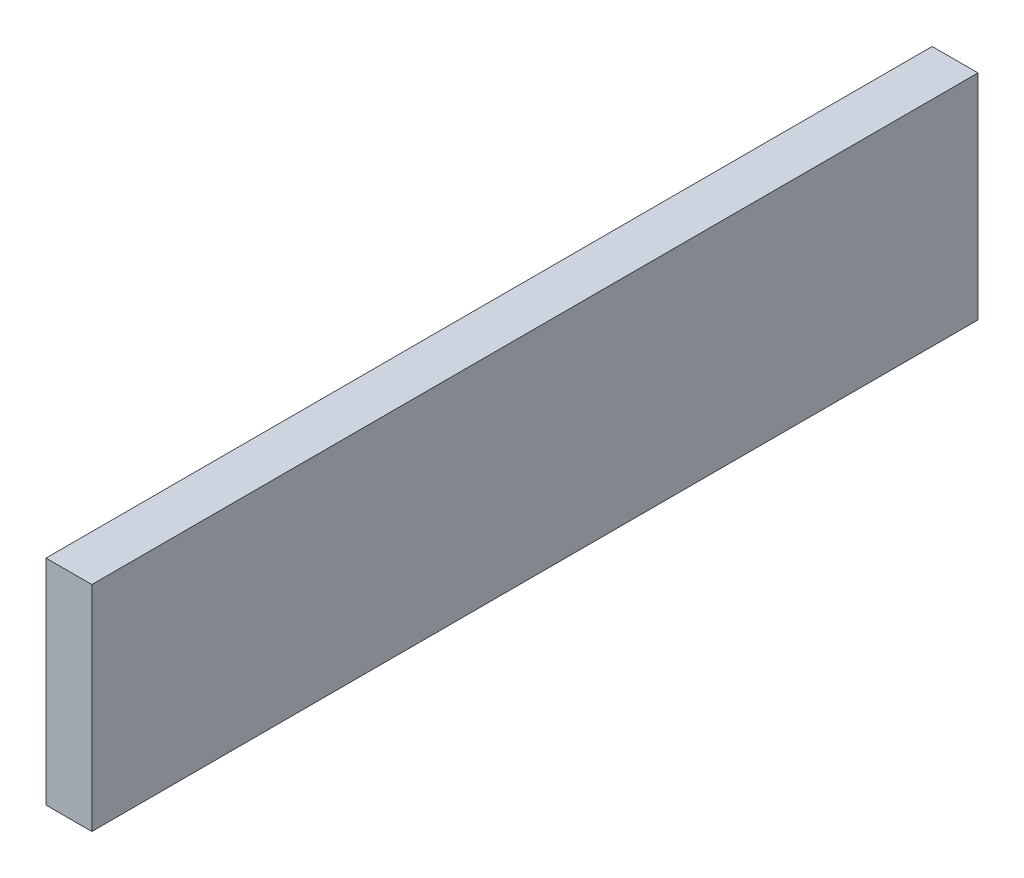
ISO-10303-21;
HEADER;
FILE_DESCRIPTION(('STEP AP214'),'2;1');
FILE_NAME('part.step','',(''),(''),'','','');
FILE_SCHEMA(('AUTOMOTIVE_DESIGN { 1 0 10303 214 1 1 1 1 }'));
ENDSEC;
DATA;
#1=APPLICATION_CONTEXT('core data for automotive mechanical design processes');
#2=APPLICATION_PROTOCOL_DEFINITION('international standard','automotive_design',2000,#1);
#3=PRODUCT_CONTEXT('',#1,'mechanical');
#4=PRODUCT('Part','Part','',(#3));
#5=PRODUCT_RELATED_PRODUCT_CATEGORY('part','',(#4));
#6=PRODUCT_DEFINITION_FORMATION('','',#4);
#7=PRODUCT_DEFINITION_CONTEXT('part definition',#1,'design');
#8=PRODUCT_DEFINITION('design','',#6,#7);
#9=PRODUCT_DEFINITION_SHAPE('','',#8);
#10=(LENGTH_UNIT() NAMED_UNIT(*) SI_UNIT(.MILLI.,.METRE.));
#11=(NAMED_UNIT(*) PLANE_ANGLE_UNIT() SI_UNIT($,.RADIAN.));
#12=(NAMED_UNIT(*) SI_UNIT($,.STERADIAN.) SOLID_ANGLE_UNIT());
#13=UNCERTAINTY_MEASURE_WITH_UNIT(LENGTH_MEASURE(1.E-05),#10,'distance_accuracy_value','');
#14=(GEOMETRIC_REPRESENTATION_CONTEXT(3) GLOBAL_UNCERTAINTY_ASSIGNED_CONTEXT((#13)) GLOBAL_UNIT_ASSIGNED_CONTEXT((#10,
#11,#12)) REPRESENTATION_CONTEXT('',''));
#15=CARTESIAN_POINT('',(0.,0.,0.));
#16=DIRECTION('',(0.,0.,1.));
#17=DIRECTION('',(1.,0.,0.));
#18=AXIS2_PLACEMENT_3D('',#15,#16,#17);
#19=CARTESIAN_POINT('',(380.,0.,580.));
#20=DIRECTION('',(-1.,0.,0.));
#21=DIRECTION('',(0.,0.,1.));
#22=AXIS2_PLACEMENT_3D('',#19,#20,#21);
#23=PLANE('',#22);
#24=DIRECTION('',(0.,1.,0.));
#25=VECTOR('',#24,1.);
#26=CARTESIAN_POINT('',(380.,0.,0.));
#27=LINE('',#26,#25);
#28=CARTESIAN_POINT('',(380.,30.,0.));
#29=VERTEX_POINT('',#28);
#30=CARTESIAN_POINT('',(380.,170.,0.));
#31=VERTEX_POINT('',#30);
#32=EDGE_CURVE('E97',#29,#31,#27,.T.);
#33=ORIENTED_EDGE('',*,*,#32,.T.);
#34=DIRECTION('',(0.,0.,-1.));
#35=VECTOR('',#34,1.);
#36=CARTESIAN_POINT('',(380.,170.,580.));
#37=LINE('',#36,#35);
#38=CARTESIAN_POINT('',(380.,170.,580.));
#39=VERTEX_POINT('',#38);
#40=EDGE_CURVE('E11',#39,#31,#37,.T.);
#41=ORIENTED_EDGE('',*,*,#40,.F.);
#42=DIRECTION('',(0.,1.,0.));
#43=VECTOR('',#42,1.);
#44=CARTESIAN_POINT('',(380.,0.,580.));
#45=LINE('',#44,#43);
#46=CARTESIAN_POINT('',(380.,30.,580.));
#47=VERTEX_POINT('',#46);
#48=EDGE_CURVE('E74',#47,#39,#45,.T.);
#49=ORIENTED_EDGE('',*,*,#48,.F.);
#50=DIRECTION('',(0.,0.,-1.));
#51=VECTOR('',#50,1.);
#52=CARTESIAN_POINT('',(380.,30.,580.));
#53=LINE('',#52,#51);
#54=EDGE_CURVE('E93',#47,#29,#53,.T.);
#55=ORIENTED_EDGE('',*,*,#54,.T.);
#56=EDGE_LOOP('',(#33,#41,#49,#55));
#57=FACE_BOUND('',#56,.T.);
#58=ADVANCED_FACE('F35',(#57),#23,.F.);
#59=CARTESIAN_POINT('',(0.,170.,580.));
#60=DIRECTION('',(0.,1.,0.));
#61=DIRECTION('',(0.,0.,1.));
#62=AXIS2_PLACEMENT_3D('',#59,#60,#61);
#63=PLANE('',#62);
#64=DIRECTION('',(1.,0.,0.));
#65=VECTOR('',#64,1.);
#66=CARTESIAN_POINT('',(0.,170.,0.));
#67=LINE('',#66,#65);
#68=CARTESIAN_POINT('',(350.,170.,0.));
#69=VERTEX_POINT('',#68);
#70=EDGE_CURVE('E83',#69,#31,#67,.T.);
#71=ORIENTED_EDGE('',*,*,#70,.F.);
#72=DIRECTION('',(0.,0.,-1.));
#73=VECTOR('',#72,1.);
#74=CARTESIAN_POINT('',(350.,170.,580.));
#75=LINE('',#74,#73);
#76=CARTESIAN_POINT('',(350.,170.,580.));
#77=VERTEX_POINT('',#76);
#78=EDGE_CURVE('E43',#77,#69,#75,.T.);
#79=ORIENTED_EDGE('',*,*,#78,.F.);
#80=DIRECTION('',(1.,0.,0.));
#81=VECTOR('',#80,1.);
#82=CARTESIAN_POINT('',(0.,170.,580.));
#83=LINE('',#82,#81);
#84=EDGE_CURVE('E81',#77,#39,#83,.T.);
#85=ORIENTED_EDGE('',*,*,#84,.T.);
#86=ORIENTED_EDGE('',*,*,#40,.T.);
#87=EDGE_LOOP('',(#71,#79,#85,#86));
#88=FACE_BOUND('',#87,.T.);
#89=ADVANCED_FACE('F80',(#88),#63,.T.);
#90=CARTESIAN_POINT('',(350.,0.,580.));
#91=DIRECTION('',(-1.,0.,0.));
#92=DIRECTION('',(0.,0.,1.));
#93=AXIS2_PLACEMENT_3D('',#90,#91,#92);
#94=PLANE('',#93);
#95=DIRECTION('',(0.,1.,0.));
#96=VECTOR('',#95,1.);
#97=CARTESIAN_POINT('',(350.,0.,0.));
#98=LINE('',#97,#96);
#99=CARTESIAN_POINT('',(350.,30.,0.));
#100=VERTEX_POINT('',#99);
#101=EDGE_CURVE('E101',#100,#69,#98,.T.);
#102=ORIENTED_EDGE('',*,*,#101,.F.);
#103=DIRECTION('',(0.,0.,-1.));
#104=VECTOR('',#103,1.);
#105=CARTESIAN_POINT('',(350.,30.,580.));
#106=LINE('',#105,#104);
#107=CARTESIAN_POINT('',(350.,30.,580.));
#108=VERTEX_POINT('',#107);
#109=EDGE_CURVE('E66',#108,#100,#106,.T.);
#110=ORIENTED_EDGE('',*,*,#109,.F.);
#111=DIRECTION('',(0.,1.,0.));
#112=VECTOR('',#111,1.);
#113=CARTESIAN_POINT('',(350.,0.,580.));
#114=LINE('',#113,#112);
#115=EDGE_CURVE('E89',#108,#77,#114,.T.);
#116=ORIENTED_EDGE('',*,*,#115,.T.);
#117=ORIENTED_EDGE('',*,*,#78,.T.);
#118=EDGE_LOOP('',(#102,#110,#116,#117));
#119=FACE_BOUND('',#118,.T.);
#120=ADVANCED_FACE('F91',(#119),#94,.T.);
#121=CARTESIAN_POINT('',(0.,30.,580.));
#122=DIRECTION('',(0.,1.,0.));
#123=DIRECTION('',(0.,0.,1.));
#124=AXIS2_PLACEMENT_3D('',#121,#122,#123);
#125=PLANE('',#124);
#126=DIRECTION('',(1.,0.,0.));
#127=VECTOR('',#126,1.);
#128=CARTESIAN_POINT('',(0.,30.,0.));
#129=LINE('',#128,#127);
#130=EDGE_CURVE('E69',#100,#29,#129,.T.);
#131=ORIENTED_EDGE('',*,*,#130,.T.);
#132=ORIENTED_EDGE('',*,*,#54,.F.);
#133=DIRECTION('',(1.,0.,0.));
#134=VECTOR('',#133,1.);
#135=CARTESIAN_POINT('',(0.,30.,580.));
#136=LINE('',#135,#134);
#137=EDGE_CURVE('E51',#108,#47,#136,.T.);
#138=ORIENTED_EDGE('',*,*,#137,.F.);
#139=ORIENTED_EDGE('',*,*,#109,.T.);
#140=EDGE_LOOP('',(#131,#132,#138,#139));
#141=FACE_BOUND('',#140,.T.);
#142=ADVANCED_FACE('F114',(#141),#125,.F.);
#143=CARTESIAN_POINT('',(0.,0.,580.));
#144=DIRECTION('',(0.,0.,1.));
#145=DIRECTION('',(1.,0.,0.));
#146=AXIS2_PLACEMENT_3D('',#143,#144,#145);
#147=PLANE('',#146);
#148=ORIENTED_EDGE('',*,*,#48,.T.);
#149=ORIENTED_EDGE('',*,*,#84,.F.);
#150=ORIENTED_EDGE('',*,*,#115,.F.);
#151=ORIENTED_EDGE('',*,*,#137,.T.);
#152=EDGE_LOOP('',(#148,#149,#150,#151));
#153=FACE_BOUND('',#152,.T.);
#154=ADVANCED_FACE('F88',(#153),#147,.T.);
#155=CARTESIAN_POINT('',(0.,0.,0.));
#156=DIRECTION('',(0.,0.,1.));
#157=DIRECTION('',(1.,0.,0.));
#158=AXIS2_PLACEMENT_3D('',#155,#156,#157);
#159=PLANE('',#158);
#160=ORIENTED_EDGE('',*,*,#32,.F.);
#161=ORIENTED_EDGE('',*,*,#130,.F.);
#162=ORIENTED_EDGE('',*,*,#101,.T.);
#163=ORIENTED_EDGE('',*,*,#70,.T.);
#164=EDGE_LOOP('',(#160,#161,#162,#163));
#165=FACE_BOUND('',#164,.T.);
#166=ADVANCED_FACE('F108',(#165),#159,.F.);
#167=CLOSED_SHELL('',(#58,#89,#120,#142,#154,#166));
#168=MANIFOLD_SOLID_BREP('B2',#167);
#169=ADVANCED_BREP_SHAPE_REPRESENTATION('',(#18,#168),#14);
#170=SHAPE_DEFINITION_REPRESENTATION(#9,#169);
ENDSEC;
END-ISO-10303-21;
